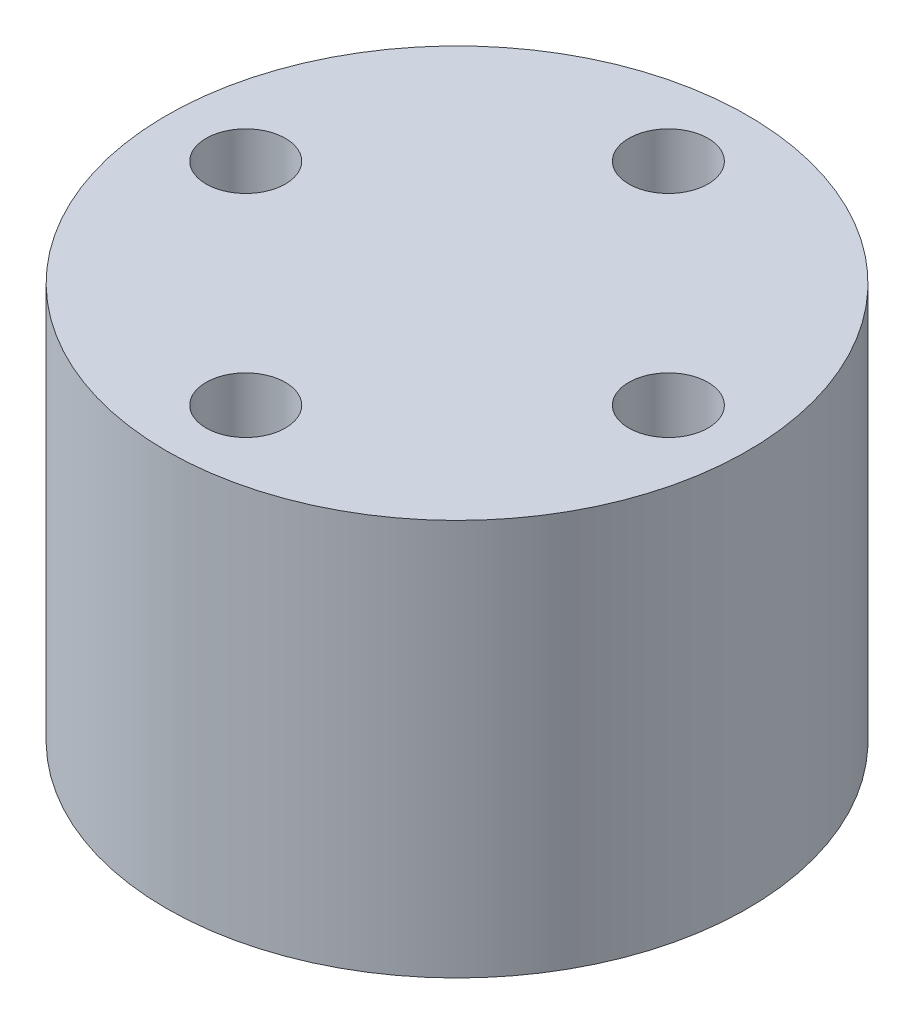
ISO-10303-21;
HEADER;
FILE_DESCRIPTION(('STEP AP214'),'2;1');
FILE_NAME('part.step','',(''),(''),'','','');
FILE_SCHEMA(('AUTOMOTIVE_DESIGN { 1 0 10303 214 1 1 1 1 }'));
ENDSEC;
DATA;
#1=APPLICATION_CONTEXT('core data for automotive mechanical design processes');
#2=APPLICATION_PROTOCOL_DEFINITION('international standard','automotive_design',2000,#1);
#3=PRODUCT_CONTEXT('',#1,'mechanical');
#4=PRODUCT('Part','Part','',(#3));
#5=PRODUCT_RELATED_PRODUCT_CATEGORY('part','',(#4));
#6=PRODUCT_DEFINITION_FORMATION('','',#4);
#7=PRODUCT_DEFINITION_CONTEXT('part definition',#1,'design');
#8=PRODUCT_DEFINITION('design','',#6,#7);
#9=PRODUCT_DEFINITION_SHAPE('','',#8);
#10=(LENGTH_UNIT() NAMED_UNIT(*) SI_UNIT(.MILLI.,.METRE.));
#11=(NAMED_UNIT(*) PLANE_ANGLE_UNIT() SI_UNIT($,.RADIAN.));
#12=(NAMED_UNIT(*) SI_UNIT($,.STERADIAN.) SOLID_ANGLE_UNIT());
#13=UNCERTAINTY_MEASURE_WITH_UNIT(LENGTH_MEASURE(1.E-05),#10,'distance_accuracy_value','');
#14=(GEOMETRIC_REPRESENTATION_CONTEXT(3) GLOBAL_UNCERTAINTY_ASSIGNED_CONTEXT((#13)) GLOBAL_UNIT_ASSIGNED_CONTEXT((#10,
#11,#12)) REPRESENTATION_CONTEXT('',''));
#15=CARTESIAN_POINT('',(0.,0.,0.));
#16=DIRECTION('',(0.,0.,1.));
#17=DIRECTION('',(1.,0.,0.));
#18=AXIS2_PLACEMENT_3D('',#15,#16,#17);
#19=CARTESIAN_POINT('',(0.,15.,0.));
#20=DIRECTION('',(0.,1.,0.));
#21=DIRECTION('',(0.,0.,1.));
#22=AXIS2_PLACEMENT_3D('',#19,#20,#21);
#23=PLANE('',#22);
#24=CARTESIAN_POINT('',(0.,15.,7.99999999999992));
#25=DIRECTION('',(0.,1.,0.));
#26=DIRECTION('',(0.,0.,1.));
#27=AXIS2_PLACEMENT_3D('',#24,#25,#26);
#28=CIRCLE('',#27,1.5);
#29=CARTESIAN_POINT('',(0.,15.,9.49999999999992));
#30=VERTEX_POINT('',#29);
#31=EDGE_CURVE('E55',#30,#30,#28,.T.);
#32=ORIENTED_EDGE('',*,*,#31,.F.);
#33=EDGE_LOOP('',(#32));
#34=FACE_BOUND('',#33,.T.);
#35=CARTESIAN_POINT('',(0.,15.,-8.));
#36=DIRECTION('',(0.,1.,0.));
#37=DIRECTION('',(0.,0.,1.));
#38=AXIS2_PLACEMENT_3D('',#35,#36,#37);
#39=CIRCLE('',#38,1.5);
#40=CARTESIAN_POINT('',(0.,15.,-6.5));
#41=VERTEX_POINT('',#40);
#42=EDGE_CURVE('E44',#41,#41,#39,.T.);
#43=ORIENTED_EDGE('',*,*,#42,.F.);
#44=EDGE_LOOP('',(#43));
#45=FACE_BOUND('',#44,.T.);
#46=CARTESIAN_POINT('',(0.,15.,0.));
#47=DIRECTION('',(0.,1.,0.));
#48=DIRECTION('',(0.,0.,1.));
#49=AXIS2_PLACEMENT_3D('',#46,#47,#48);
#50=CIRCLE('',#49,11.);
#51=CARTESIAN_POINT('',(0.,15.,11.));
#52=VERTEX_POINT('',#51);
#53=EDGE_CURVE('E10',#52,#52,#50,.T.);
#54=ORIENTED_EDGE('',*,*,#53,.T.);
#55=EDGE_LOOP('',(#54));
#56=FACE_BOUND('',#55,.T.);
#57=CARTESIAN_POINT('',(8.,15.,0.));
#58=DIRECTION('',(0.,1.,0.));
#59=DIRECTION('',(0.,0.,1.));
#60=AXIS2_PLACEMENT_3D('',#57,#58,#59);
#61=CIRCLE('',#60,1.5);
#62=CARTESIAN_POINT('',(8.,15.,1.50000000000003));
#63=VERTEX_POINT('',#62);
#64=EDGE_CURVE('E49',#63,#63,#61,.T.);
#65=ORIENTED_EDGE('',*,*,#64,.F.);
#66=EDGE_LOOP('',(#65));
#67=FACE_BOUND('',#66,.T.);
#68=CARTESIAN_POINT('',(-8.,15.,0.));
#69=DIRECTION('',(0.,1.,0.));
#70=DIRECTION('',(0.,0.,1.));
#71=AXIS2_PLACEMENT_3D('',#68,#69,#70);
#72=CIRCLE('',#71,1.50000000000008);
#73=CARTESIAN_POINT('',(-8.,15.,1.50000000000008));
#74=VERTEX_POINT('',#73);
#75=EDGE_CURVE('E61',#74,#74,#72,.T.);
#76=ORIENTED_EDGE('',*,*,#75,.F.);
#77=EDGE_LOOP('',(#76));
#78=FACE_BOUND('',#77,.T.);
#79=ADVANCED_FACE('F33',(#34,#45,#56,#67,#78),#23,.T.);
#80=CARTESIAN_POINT('',(0.,0.,0.));
#81=DIRECTION('',(0.,1.,0.));
#82=DIRECTION('',(0.,0.,1.));
#83=AXIS2_PLACEMENT_3D('',#80,#81,#82);
#84=PLANE('',#83);
#85=CARTESIAN_POINT('',(0.,0.,0.));
#86=DIRECTION('',(0.,1.,0.));
#87=DIRECTION('',(0.,0.,1.));
#88=AXIS2_PLACEMENT_3D('',#85,#86,#87);
#89=CIRCLE('',#88,11.);
#90=CARTESIAN_POINT('',(0.,0.,11.));
#91=VERTEX_POINT('',#90);
#92=EDGE_CURVE('E37',#91,#91,#89,.T.);
#93=ORIENTED_EDGE('',*,*,#92,.F.);
#94=EDGE_LOOP('',(#93));
#95=FACE_BOUND('',#94,.T.);
#96=CARTESIAN_POINT('',(0.,0.,-8.));
#97=DIRECTION('',(0.,1.,0.));
#98=DIRECTION('',(0.,0.,1.));
#99=AXIS2_PLACEMENT_3D('',#96,#97,#98);
#100=CIRCLE('',#99,1.5);
#101=CARTESIAN_POINT('',(0.,0.,-6.5));
#102=VERTEX_POINT('',#101);
#103=EDGE_CURVE('E46',#102,#102,#100,.T.);
#104=ORIENTED_EDGE('',*,*,#103,.T.);
#105=EDGE_LOOP('',(#104));
#106=FACE_BOUND('',#105,.T.);
#107=CARTESIAN_POINT('',(8.,0.,0.));
#108=DIRECTION('',(0.,1.,0.));
#109=DIRECTION('',(0.,0.,1.));
#110=AXIS2_PLACEMENT_3D('',#107,#108,#109);
#111=CIRCLE('',#110,1.5);
#112=CARTESIAN_POINT('',(8.,0.,1.50000000000003));
#113=VERTEX_POINT('',#112);
#114=EDGE_CURVE('E52',#113,#113,#111,.T.);
#115=ORIENTED_EDGE('',*,*,#114,.T.);
#116=EDGE_LOOP('',(#115));
#117=FACE_BOUND('',#116,.T.);
#118=CARTESIAN_POINT('',(0.,0.,7.99999999999992));
#119=DIRECTION('',(0.,1.,0.));
#120=DIRECTION('',(0.,0.,1.));
#121=AXIS2_PLACEMENT_3D('',#118,#119,#120);
#122=CIRCLE('',#121,1.5);
#123=CARTESIAN_POINT('',(0.,0.,9.49999999999992));
#124=VERTEX_POINT('',#123);
#125=EDGE_CURVE('E58',#124,#124,#122,.T.);
#126=ORIENTED_EDGE('',*,*,#125,.T.);
#127=EDGE_LOOP('',(#126));
#128=FACE_BOUND('',#127,.T.);
#129=CARTESIAN_POINT('',(-8.,0.,0.));
#130=DIRECTION('',(0.,1.,0.));
#131=DIRECTION('',(0.,0.,1.));
#132=AXIS2_PLACEMENT_3D('',#129,#130,#131);
#133=CIRCLE('',#132,1.50000000000008);
#134=CARTESIAN_POINT('',(-8.,0.,1.50000000000008));
#135=VERTEX_POINT('',#134);
#136=EDGE_CURVE('E64',#135,#135,#133,.T.);
#137=ORIENTED_EDGE('',*,*,#136,.T.);
#138=EDGE_LOOP('',(#137));
#139=FACE_BOUND('',#138,.T.);
#140=ADVANCED_FACE('F74',(#95,#106,#117,#128,#139),#84,.F.);
#141=CARTESIAN_POINT('',(0.,15.,0.));
#142=DIRECTION('',(0.,-1.,0.));
#143=DIRECTION('',(0.,0.,-1.));
#144=AXIS2_PLACEMENT_3D('',#141,#142,#143);
#145=CYLINDRICAL_SURFACE('',#144,11.);
#146=ORIENTED_EDGE('',*,*,#53,.F.);
#147=EDGE_LOOP('',(#146));
#148=FACE_BOUND('',#147,.T.);
#149=ORIENTED_EDGE('',*,*,#92,.T.);
#150=EDGE_LOOP('',(#149));
#151=FACE_BOUND('',#150,.T.);
#152=ADVANCED_FACE('F35',(#148,#151),#145,.T.);
#153=CARTESIAN_POINT('',(0.,15.,-8.));
#154=DIRECTION('',(0.,-1.,0.));
#155=DIRECTION('',(0.,0.,-1.));
#156=AXIS2_PLACEMENT_3D('',#153,#154,#155);
#157=CYLINDRICAL_SURFACE('',#156,1.5);
#158=ORIENTED_EDGE('',*,*,#42,.T.);
#159=EDGE_LOOP('',(#158));
#160=FACE_BOUND('',#159,.T.);
#161=ORIENTED_EDGE('',*,*,#103,.F.);
#162=EDGE_LOOP('',(#161));
#163=FACE_BOUND('',#162,.T.);
#164=ADVANCED_FACE('F84',(#160,#163),#157,.F.);
#165=CARTESIAN_POINT('',(8.,15.,0.));
#166=DIRECTION('',(0.,-1.,0.));
#167=DIRECTION('',(0.,0.,-1.));
#168=AXIS2_PLACEMENT_3D('',#165,#166,#167);
#169=CYLINDRICAL_SURFACE('',#168,1.5);
#170=ORIENTED_EDGE('',*,*,#64,.T.);
#171=EDGE_LOOP('',(#170));
#172=FACE_BOUND('',#171,.T.);
#173=ORIENTED_EDGE('',*,*,#114,.F.);
#174=EDGE_LOOP('',(#173));
#175=FACE_BOUND('',#174,.T.);
#176=ADVANCED_FACE('F87',(#172,#175),#169,.F.);
#177=CARTESIAN_POINT('',(0.,15.,7.99999999999992));
#178=DIRECTION('',(0.,-1.,0.));
#179=DIRECTION('',(0.,0.,-1.));
#180=AXIS2_PLACEMENT_3D('',#177,#178,#179);
#181=CYLINDRICAL_SURFACE('',#180,1.5);
#182=ORIENTED_EDGE('',*,*,#31,.T.);
#183=EDGE_LOOP('',(#182));
#184=FACE_BOUND('',#183,.T.);
#185=ORIENTED_EDGE('',*,*,#125,.F.);
#186=EDGE_LOOP('',(#185));
#187=FACE_BOUND('',#186,.T.);
#188=ADVANCED_FACE('F91',(#184,#187),#181,.F.);
#189=CARTESIAN_POINT('',(-8.,15.,0.));
#190=DIRECTION('',(0.,-1.,0.));
#191=DIRECTION('',(0.,0.,-1.));
#192=AXIS2_PLACEMENT_3D('',#189,#190,#191);
#193=CYLINDRICAL_SURFACE('',#192,1.50000000000008);
#194=ORIENTED_EDGE('',*,*,#75,.T.);
#195=EDGE_LOOP('',(#194));
#196=FACE_BOUND('',#195,.T.);
#197=ORIENTED_EDGE('',*,*,#136,.F.);
#198=EDGE_LOOP('',(#197));
#199=FACE_BOUND('',#198,.T.);
#200=ADVANCED_FACE('F70',(#196,#199),#193,.F.);
#201=CLOSED_SHELL('',(#79,#140,#152,#164,#176,#188,#200));
#202=MANIFOLD_SOLID_BREP('B2',#201);
#203=ADVANCED_BREP_SHAPE_REPRESENTATION('',(#18,#202),#14);
#204=SHAPE_DEFINITION_REPRESENTATION(#9,#203);
ENDSEC;
END-ISO-10303-21;
